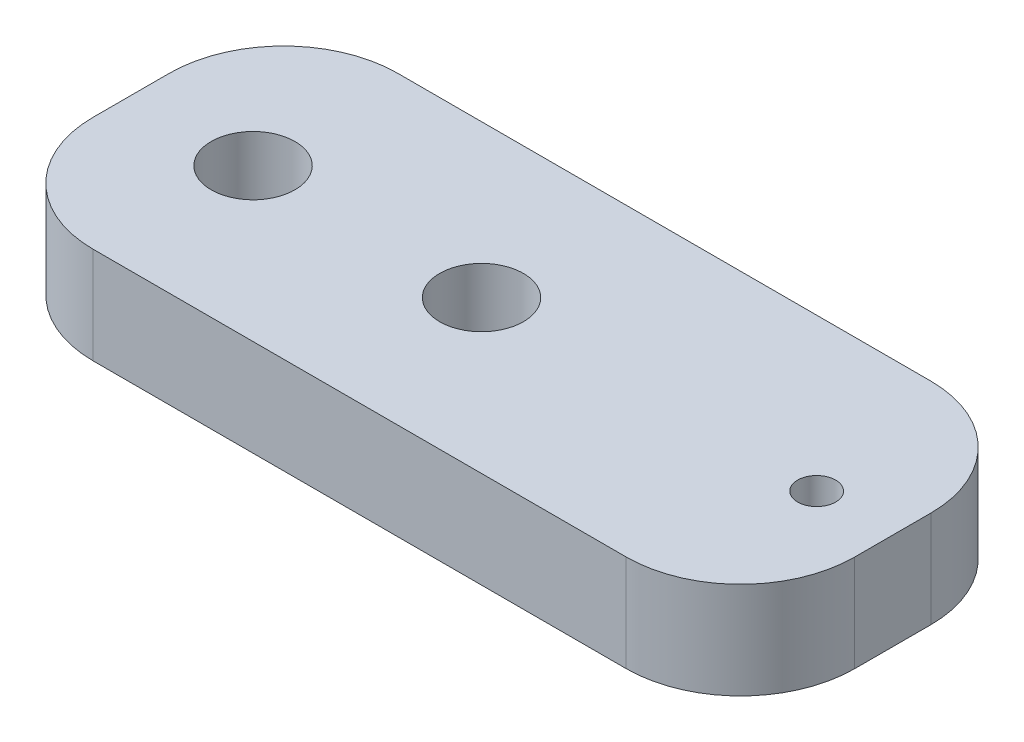
ISO-10303-21;
HEADER;
FILE_DESCRIPTION(('STEP AP214'),'2;1');
FILE_NAME('part.step','',(''),(''),'','','');
FILE_SCHEMA(('AUTOMOTIVE_DESIGN { 1 0 10303 214 1 1 1 1 }'));
ENDSEC;
DATA;
#1=APPLICATION_CONTEXT('core data for automotive mechanical design processes');
#2=APPLICATION_PROTOCOL_DEFINITION('international standard','automotive_design',2000,#1);
#3=PRODUCT_CONTEXT('',#1,'mechanical');
#4=PRODUCT('Part','Part','',(#3));
#5=PRODUCT_RELATED_PRODUCT_CATEGORY('part','',(#4));
#6=PRODUCT_DEFINITION_FORMATION('','',#4);
#7=PRODUCT_DEFINITION_CONTEXT('part definition',#1,'design');
#8=PRODUCT_DEFINITION('design','',#6,#7);
#9=PRODUCT_DEFINITION_SHAPE('','',#8);
#10=(LENGTH_UNIT() NAMED_UNIT(*) SI_UNIT(.MILLI.,.METRE.));
#11=(NAMED_UNIT(*) PLANE_ANGLE_UNIT() SI_UNIT($,.RADIAN.));
#12=(NAMED_UNIT(*) SI_UNIT($,.STERADIAN.) SOLID_ANGLE_UNIT());
#13=UNCERTAINTY_MEASURE_WITH_UNIT(LENGTH_MEASURE(1.E-05),#10,'distance_accuracy_value','');
#14=(GEOMETRIC_REPRESENTATION_CONTEXT(3) GLOBAL_UNCERTAINTY_ASSIGNED_CONTEXT((#13)) GLOBAL_UNIT_ASSIGNED_CONTEXT((#10,
#11,#12)) REPRESENTATION_CONTEXT('',''));
#15=CARTESIAN_POINT('',(0.,0.,0.));
#16=DIRECTION('',(0.,0.,1.));
#17=DIRECTION('',(1.,0.,0.));
#18=AXIS2_PLACEMENT_3D('',#15,#16,#17);
#19=CARTESIAN_POINT('',(0.,6.35,0.));
#20=DIRECTION('',(1.,0.,0.));
#21=DIRECTION('',(0.,0.,-1.));
#22=AXIS2_PLACEMENT_3D('',#19,#20,#21);
#23=PLANE('',#22);
#24=DIRECTION('',(0.,0.,1.));
#25=VECTOR('',#24,1.);
#26=CARTESIAN_POINT('',(0.,6.35,0.));
#27=LINE('',#26,#25);
#28=CARTESIAN_POINT('',(0.,6.35,-12.5));
#29=VERTEX_POINT('',#28);
#30=CARTESIAN_POINT('',(0.,6.35,-7.5));
#31=VERTEX_POINT('',#30);
#32=EDGE_CURVE('E128',#29,#31,#27,.T.);
#33=ORIENTED_EDGE('',*,*,#32,.F.);
#34=DIRECTION('',(0.,-1.,0.));
#35=VECTOR('',#34,1.);
#36=CARTESIAN_POINT('',(0.,6.35,-12.5));
#37=LINE('',#36,#35);
#38=CARTESIAN_POINT('',(0.,0.,-12.5));
#39=VERTEX_POINT('',#38);
#40=EDGE_CURVE('E11',#29,#39,#37,.T.);
#41=ORIENTED_EDGE('',*,*,#40,.T.);
#42=DIRECTION('',(0.,0.,1.));
#43=VECTOR('',#42,1.);
#44=CARTESIAN_POINT('',(0.,0.,0.));
#45=LINE('',#44,#43);
#46=CARTESIAN_POINT('',(0.,0.,-7.5));
#47=VERTEX_POINT('',#46);
#48=EDGE_CURVE('E130',#39,#47,#45,.T.);
#49=ORIENTED_EDGE('',*,*,#48,.T.);
#50=DIRECTION('',(0.,-1.,0.));
#51=VECTOR('',#50,1.);
#52=CARTESIAN_POINT('',(0.,6.35,-7.5));
#53=LINE('',#52,#51);
#54=EDGE_CURVE('E41',#47,#31,#53,.F.);
#55=ORIENTED_EDGE('',*,*,#54,.T.);
#56=EDGE_LOOP('',(#33,#41,#49,#55));
#57=FACE_BOUND('',#56,.T.);
#58=ADVANCED_FACE('F33',(#57),#23,.F.);
#59=CARTESIAN_POINT('',(0.,6.35,0.));
#60=DIRECTION('',(0.,0.,-1.));
#61=DIRECTION('',(-1.,0.,0.));
#62=AXIS2_PLACEMENT_3D('',#59,#60,#61);
#63=PLANE('',#62);
#64=DIRECTION('',(1.,0.,0.));
#65=VECTOR('',#64,1.);
#66=CARTESIAN_POINT('',(0.,0.,0.));
#67=LINE('',#66,#65);
#68=CARTESIAN_POINT('',(7.5,0.,0.));
#69=VERTEX_POINT('',#68);
#70=CARTESIAN_POINT('',(42.5,0.,0.));
#71=VERTEX_POINT('',#70);
#72=EDGE_CURVE('E126',#69,#71,#67,.T.);
#73=ORIENTED_EDGE('',*,*,#72,.T.);
#74=DIRECTION('',(0.,-1.,0.));
#75=VECTOR('',#74,1.);
#76=CARTESIAN_POINT('',(42.5,6.35,0.));
#77=LINE('',#76,#75);
#78=CARTESIAN_POINT('',(42.5,6.35,0.));
#79=VERTEX_POINT('',#78);
#80=EDGE_CURVE('E105',#71,#79,#77,.F.);
#81=ORIENTED_EDGE('',*,*,#80,.T.);
#82=DIRECTION('',(1.,0.,0.));
#83=VECTOR('',#82,1.);
#84=CARTESIAN_POINT('',(0.,6.35,0.));
#85=LINE('',#84,#83);
#86=CARTESIAN_POINT('',(7.5,6.35,0.));
#87=VERTEX_POINT('',#86);
#88=EDGE_CURVE('E166',#87,#79,#85,.T.);
#89=ORIENTED_EDGE('',*,*,#88,.F.);
#90=DIRECTION('',(0.,-1.,0.));
#91=VECTOR('',#90,1.);
#92=CARTESIAN_POINT('',(7.5,6.35,0.));
#93=LINE('',#92,#91);
#94=EDGE_CURVE('E110',#87,#69,#93,.T.);
#95=ORIENTED_EDGE('',*,*,#94,.T.);
#96=EDGE_LOOP('',(#73,#81,#89,#95));
#97=FACE_BOUND('',#96,.T.);
#98=ADVANCED_FACE('F170',(#97),#63,.F.);
#99=CARTESIAN_POINT('',(50.,6.35,0.));
#100=DIRECTION('',(-1.,0.,0.));
#101=DIRECTION('',(0.,0.,1.));
#102=AXIS2_PLACEMENT_3D('',#99,#100,#101);
#103=PLANE('',#102);
#104=DIRECTION('',(0.,0.,-1.));
#105=VECTOR('',#104,1.);
#106=CARTESIAN_POINT('',(50.,6.35,0.));
#107=LINE('',#106,#105);
#108=CARTESIAN_POINT('',(50.,6.35,-7.5));
#109=VERTEX_POINT('',#108);
#110=CARTESIAN_POINT('',(50.,6.35,-12.5));
#111=VERTEX_POINT('',#110);
#112=EDGE_CURVE('E119',#109,#111,#107,.T.);
#113=ORIENTED_EDGE('',*,*,#112,.F.);
#114=DIRECTION('',(0.,-1.,0.));
#115=VECTOR('',#114,1.);
#116=CARTESIAN_POINT('',(50.,6.35,-7.5));
#117=LINE('',#116,#115);
#118=CARTESIAN_POINT('',(50.,0.,-7.5));
#119=VERTEX_POINT('',#118);
#120=EDGE_CURVE('E104',#109,#119,#117,.T.);
#121=ORIENTED_EDGE('',*,*,#120,.T.);
#122=DIRECTION('',(0.,0.,-1.));
#123=VECTOR('',#122,1.);
#124=CARTESIAN_POINT('',(50.,0.,0.));
#125=LINE('',#124,#123);
#126=CARTESIAN_POINT('',(50.,0.,-12.5));
#127=VERTEX_POINT('',#126);
#128=EDGE_CURVE('E117',#119,#127,#125,.T.);
#129=ORIENTED_EDGE('',*,*,#128,.T.);
#130=DIRECTION('',(0.,-1.,0.));
#131=VECTOR('',#130,1.);
#132=CARTESIAN_POINT('',(50.,6.35,-12.5));
#133=LINE('',#132,#131);
#134=EDGE_CURVE('E121',#127,#111,#133,.F.);
#135=ORIENTED_EDGE('',*,*,#134,.T.);
#136=EDGE_LOOP('',(#113,#121,#129,#135));
#137=FACE_BOUND('',#136,.T.);
#138=ADVANCED_FACE('F116',(#137),#103,.F.);
#139=CARTESIAN_POINT('',(0.,6.35,-20.));
#140=DIRECTION('',(0.,0.,1.));
#141=DIRECTION('',(1.,0.,0.));
#142=AXIS2_PLACEMENT_3D('',#139,#140,#141);
#143=PLANE('',#142);
#144=DIRECTION('',(-1.,0.,0.));
#145=VECTOR('',#144,1.);
#146=CARTESIAN_POINT('',(0.,6.35,-20.));
#147=LINE('',#146,#145);
#148=CARTESIAN_POINT('',(42.5,6.35,-20.));
#149=VERTEX_POINT('',#148);
#150=CARTESIAN_POINT('',(7.5,6.35,-20.));
#151=VERTEX_POINT('',#150);
#152=EDGE_CURVE('E134',#149,#151,#147,.T.);
#153=ORIENTED_EDGE('',*,*,#152,.F.);
#154=DIRECTION('',(0.,-1.,0.));
#155=VECTOR('',#154,1.);
#156=CARTESIAN_POINT('',(42.5,6.35,-20.));
#157=LINE('',#156,#155);
#158=CARTESIAN_POINT('',(42.5,0.,-20.));
#159=VERTEX_POINT('',#158);
#160=EDGE_CURVE('E151',#149,#159,#157,.T.);
#161=ORIENTED_EDGE('',*,*,#160,.T.);
#162=DIRECTION('',(-1.,0.,0.));
#163=VECTOR('',#162,1.);
#164=CARTESIAN_POINT('',(0.,0.,-20.));
#165=LINE('',#164,#163);
#166=CARTESIAN_POINT('',(7.5,0.,-20.));
#167=VERTEX_POINT('',#166);
#168=EDGE_CURVE('E125',#159,#167,#165,.T.);
#169=ORIENTED_EDGE('',*,*,#168,.T.);
#170=DIRECTION('',(0.,-1.,0.));
#171=VECTOR('',#170,1.);
#172=CARTESIAN_POINT('',(7.5,6.35,-20.));
#173=LINE('',#172,#171);
#174=EDGE_CURVE('E48',#167,#151,#173,.F.);
#175=ORIENTED_EDGE('',*,*,#174,.T.);
#176=EDGE_LOOP('',(#153,#161,#169,#175));
#177=FACE_BOUND('',#176,.T.);
#178=ADVANCED_FACE('F198',(#177),#143,.F.);
#179=CARTESIAN_POINT('',(0.,6.35,0.));
#180=DIRECTION('',(0.,-1.,0.));
#181=DIRECTION('',(0.,0.,-1.));
#182=AXIS2_PLACEMENT_3D('',#179,#180,#181);
#183=PLANE('',#182);
#184=CARTESIAN_POINT('',(45.,6.35,-9.99999999999999));
#185=DIRECTION('',(0.,1.,0.));
#186=DIRECTION('',(0.,0.,1.));
#187=AXIS2_PLACEMENT_3D('',#184,#185,#186);
#188=CIRCLE('',#187,1.25);
#189=CARTESIAN_POINT('',(45.,6.35,-8.74999999999999));
#190=VERTEX_POINT('',#189);
#191=EDGE_CURVE('E190',#190,#190,#188,.T.);
#192=ORIENTED_EDGE('',*,*,#191,.F.);
#193=EDGE_LOOP('',(#192));
#194=FACE_BOUND('',#193,.T.);
#195=CARTESIAN_POINT('',(8.,6.35,-10.));
#196=DIRECTION('',(0.,1.,0.));
#197=DIRECTION('',(0.,0.,1.));
#198=AXIS2_PLACEMENT_3D('',#195,#196,#197);
#199=CIRCLE('',#198,2.75);
#200=CARTESIAN_POINT('',(8.,6.35,-7.25));
#201=VERTEX_POINT('',#200);
#202=EDGE_CURVE('E184',#201,#201,#199,.T.);
#203=ORIENTED_EDGE('',*,*,#202,.F.);
#204=EDGE_LOOP('',(#203));
#205=FACE_BOUND('',#204,.T.);
#206=CARTESIAN_POINT('',(23.,6.35,-10.));
#207=DIRECTION('',(0.,1.,0.));
#208=DIRECTION('',(0.,0.,1.));
#209=AXIS2_PLACEMENT_3D('',#206,#207,#208);
#210=CIRCLE('',#209,2.75);
#211=CARTESIAN_POINT('',(23.,6.35,-7.25));
#212=VERTEX_POINT('',#211);
#213=EDGE_CURVE('E173',#212,#212,#210,.T.);
#214=ORIENTED_EDGE('',*,*,#213,.F.);
#215=EDGE_LOOP('',(#214));
#216=FACE_BOUND('',#215,.T.);
#217=ORIENTED_EDGE('',*,*,#88,.T.);
#218=CARTESIAN_POINT('',(42.5,6.35,-7.5));
#219=DIRECTION('',(0.,-1.,0.));
#220=DIRECTION('',(0.,0.,-1.));
#221=AXIS2_PLACEMENT_3D('',#218,#219,#220);
#222=CIRCLE('',#221,7.5);
#223=EDGE_CURVE('E148',#79,#109,#222,.F.);
#224=ORIENTED_EDGE('',*,*,#223,.T.);
#225=ORIENTED_EDGE('',*,*,#112,.T.);
#226=CARTESIAN_POINT('',(42.5,6.35,-12.5));
#227=DIRECTION('',(0.,-1.,0.));
#228=DIRECTION('',(0.,0.,-1.));
#229=AXIS2_PLACEMENT_3D('',#226,#227,#228);
#230=CIRCLE('',#229,7.5);
#231=EDGE_CURVE('E55',#111,#149,#230,.F.);
#232=ORIENTED_EDGE('',*,*,#231,.T.);
#233=ORIENTED_EDGE('',*,*,#152,.T.);
#234=CARTESIAN_POINT('',(7.5,6.35,-12.5));
#235=DIRECTION('',(0.,-1.,0.));
#236=DIRECTION('',(0.,0.,-1.));
#237=AXIS2_PLACEMENT_3D('',#234,#235,#236);
#238=CIRCLE('',#237,7.5);
#239=EDGE_CURVE('E145',#151,#29,#238,.F.);
#240=ORIENTED_EDGE('',*,*,#239,.T.);
#241=ORIENTED_EDGE('',*,*,#32,.T.);
#242=CARTESIAN_POINT('',(7.5,6.35,-7.5));
#243=DIRECTION('',(0.,-1.,0.));
#244=DIRECTION('',(0.,0.,-1.));
#245=AXIS2_PLACEMENT_3D('',#242,#243,#244);
#246=CIRCLE('',#245,7.5);
#247=EDGE_CURVE('E143',#31,#87,#246,.F.);
#248=ORIENTED_EDGE('',*,*,#247,.T.);
#249=EDGE_LOOP('',(#217,#224,#225,#232,#233,#240,#241,#248));
#250=FACE_BOUND('',#249,.T.);
#251=ADVANCED_FACE('F163',(#194,#205,#216,#250),#183,.F.);
#252=CARTESIAN_POINT('',(0.,0.,0.));
#253=DIRECTION('',(0.,-1.,0.));
#254=DIRECTION('',(0.,0.,-1.));
#255=AXIS2_PLACEMENT_3D('',#252,#253,#254);
#256=PLANE('',#255);
#257=CARTESIAN_POINT('',(45.,0.,-9.99999999999999));
#258=DIRECTION('',(0.,1.,0.));
#259=DIRECTION('',(0.,0.,1.));
#260=AXIS2_PLACEMENT_3D('',#257,#258,#259);
#261=CIRCLE('',#260,1.25);
#262=CARTESIAN_POINT('',(45.,0.,-8.74999999999999));
#263=VERTEX_POINT('',#262);
#264=EDGE_CURVE('E187',#263,#263,#261,.T.);
#265=ORIENTED_EDGE('',*,*,#264,.T.);
#266=EDGE_LOOP('',(#265));
#267=FACE_BOUND('',#266,.T.);
#268=CARTESIAN_POINT('',(8.,0.,-10.));
#269=DIRECTION('',(0.,1.,0.));
#270=DIRECTION('',(0.,0.,1.));
#271=AXIS2_PLACEMENT_3D('',#268,#269,#270);
#272=CIRCLE('',#271,2.75);
#273=CARTESIAN_POINT('',(8.,0.,-7.25));
#274=VERTEX_POINT('',#273);
#275=EDGE_CURVE('E181',#274,#274,#272,.T.);
#276=ORIENTED_EDGE('',*,*,#275,.T.);
#277=EDGE_LOOP('',(#276));
#278=FACE_BOUND('',#277,.T.);
#279=CARTESIAN_POINT('',(23.,0.,-10.));
#280=DIRECTION('',(0.,1.,0.));
#281=DIRECTION('',(0.,0.,1.));
#282=AXIS2_PLACEMENT_3D('',#279,#280,#281);
#283=CIRCLE('',#282,2.75);
#284=CARTESIAN_POINT('',(23.,0.,-7.25));
#285=VERTEX_POINT('',#284);
#286=EDGE_CURVE('E171',#285,#285,#283,.T.);
#287=ORIENTED_EDGE('',*,*,#286,.T.);
#288=EDGE_LOOP('',(#287));
#289=FACE_BOUND('',#288,.T.);
#290=ORIENTED_EDGE('',*,*,#128,.F.);
#291=CARTESIAN_POINT('',(42.5,0.,-7.5));
#292=DIRECTION('',(0.,-1.,0.));
#293=DIRECTION('',(0.,0.,-1.));
#294=AXIS2_PLACEMENT_3D('',#291,#292,#293);
#295=CIRCLE('',#294,7.5);
#296=EDGE_CURVE('E100',#119,#71,#295,.T.);
#297=ORIENTED_EDGE('',*,*,#296,.T.);
#298=ORIENTED_EDGE('',*,*,#72,.F.);
#299=CARTESIAN_POINT('',(7.5,0.,-7.5));
#300=DIRECTION('',(0.,-1.,0.));
#301=DIRECTION('',(0.,0.,-1.));
#302=AXIS2_PLACEMENT_3D('',#299,#300,#301);
#303=CIRCLE('',#302,7.5);
#304=EDGE_CURVE('E120',#69,#47,#303,.T.);
#305=ORIENTED_EDGE('',*,*,#304,.T.);
#306=ORIENTED_EDGE('',*,*,#48,.F.);
#307=CARTESIAN_POINT('',(7.5,0.,-12.5));
#308=DIRECTION('',(0.,-1.,0.));
#309=DIRECTION('',(0.,0.,-1.));
#310=AXIS2_PLACEMENT_3D('',#307,#308,#309);
#311=CIRCLE('',#310,7.5);
#312=EDGE_CURVE('E137',#39,#167,#311,.T.);
#313=ORIENTED_EDGE('',*,*,#312,.T.);
#314=ORIENTED_EDGE('',*,*,#168,.F.);
#315=CARTESIAN_POINT('',(42.5,0.,-12.5));
#316=DIRECTION('',(0.,-1.,0.));
#317=DIRECTION('',(0.,0.,-1.));
#318=AXIS2_PLACEMENT_3D('',#315,#316,#317);
#319=CIRCLE('',#318,7.5);
#320=EDGE_CURVE('E111',#159,#127,#319,.T.);
#321=ORIENTED_EDGE('',*,*,#320,.T.);
#322=EDGE_LOOP('',(#290,#297,#298,#305,#306,#313,#314,#321));
#323=FACE_BOUND('',#322,.T.);
#324=ADVANCED_FACE('F123',(#267,#278,#289,#323),#256,.T.);
#325=CARTESIAN_POINT('',(23.,6.35,-10.));
#326=DIRECTION('',(0.,1.,0.));
#327=DIRECTION('',(0.,0.,1.));
#328=AXIS2_PLACEMENT_3D('',#325,#326,#327);
#329=CYLINDRICAL_SURFACE('',#328,2.75);
#330=ORIENTED_EDGE('',*,*,#286,.F.);
#331=EDGE_LOOP('',(#330));
#332=FACE_BOUND('',#331,.T.);
#333=ORIENTED_EDGE('',*,*,#213,.T.);
#334=EDGE_LOOP('',(#333));
#335=FACE_BOUND('',#334,.T.);
#336=ADVANCED_FACE('F204',(#332,#335),#329,.F.);
#337=CARTESIAN_POINT('',(8.,6.35,-10.));
#338=DIRECTION('',(0.,1.,0.));
#339=DIRECTION('',(0.,0.,1.));
#340=AXIS2_PLACEMENT_3D('',#337,#338,#339);
#341=CYLINDRICAL_SURFACE('',#340,2.75);
#342=ORIENTED_EDGE('',*,*,#275,.F.);
#343=EDGE_LOOP('',(#342));
#344=FACE_BOUND('',#343,.T.);
#345=ORIENTED_EDGE('',*,*,#202,.T.);
#346=EDGE_LOOP('',(#345));
#347=FACE_BOUND('',#346,.T.);
#348=ADVANCED_FACE('F206',(#344,#347),#341,.F.);
#349=CARTESIAN_POINT('',(45.,6.35,-9.99999999999999));
#350=DIRECTION('',(0.,1.,0.));
#351=DIRECTION('',(0.,0.,1.));
#352=AXIS2_PLACEMENT_3D('',#349,#350,#351);
#353=CYLINDRICAL_SURFACE('',#352,1.25);
#354=ORIENTED_EDGE('',*,*,#264,.F.);
#355=EDGE_LOOP('',(#354));
#356=FACE_BOUND('',#355,.T.);
#357=ORIENTED_EDGE('',*,*,#191,.T.);
#358=EDGE_LOOP('',(#357));
#359=FACE_BOUND('',#358,.T.);
#360=ADVANCED_FACE('F194',(#356,#359),#353,.F.);
#361=CARTESIAN_POINT('',(42.5,6.35,-7.5));
#362=DIRECTION('',(0.,-1.,0.));
#363=DIRECTION('',(0.,0.,-1.));
#364=AXIS2_PLACEMENT_3D('',#361,#362,#363);
#365=CYLINDRICAL_SURFACE('',#364,7.5);
#366=ORIENTED_EDGE('',*,*,#223,.F.);
#367=ORIENTED_EDGE('',*,*,#80,.F.);
#368=ORIENTED_EDGE('',*,*,#296,.F.);
#369=ORIENTED_EDGE('',*,*,#120,.F.);
#370=EDGE_LOOP('',(#366,#367,#368,#369));
#371=FACE_BOUND('',#370,.T.);
#372=ADVANCED_FACE('F103',(#371),#365,.T.);
#373=CARTESIAN_POINT('',(42.5,6.35,-12.5));
#374=DIRECTION('',(0.,-1.,0.));
#375=DIRECTION('',(0.,0.,-1.));
#376=AXIS2_PLACEMENT_3D('',#373,#374,#375);
#377=CYLINDRICAL_SURFACE('',#376,7.5);
#378=ORIENTED_EDGE('',*,*,#231,.F.);
#379=ORIENTED_EDGE('',*,*,#134,.F.);
#380=ORIENTED_EDGE('',*,*,#320,.F.);
#381=ORIENTED_EDGE('',*,*,#160,.F.);
#382=EDGE_LOOP('',(#378,#379,#380,#381));
#383=FACE_BOUND('',#382,.T.);
#384=ADVANCED_FACE('F228',(#383),#377,.T.);
#385=CARTESIAN_POINT('',(7.5,6.35,-12.5));
#386=DIRECTION('',(0.,-1.,0.));
#387=DIRECTION('',(0.,0.,-1.));
#388=AXIS2_PLACEMENT_3D('',#385,#386,#387);
#389=CYLINDRICAL_SURFACE('',#388,7.5);
#390=ORIENTED_EDGE('',*,*,#239,.F.);
#391=ORIENTED_EDGE('',*,*,#174,.F.);
#392=ORIENTED_EDGE('',*,*,#312,.F.);
#393=ORIENTED_EDGE('',*,*,#40,.F.);
#394=EDGE_LOOP('',(#390,#391,#392,#393));
#395=FACE_BOUND('',#394,.T.);
#396=ADVANCED_FACE('F230',(#395),#389,.T.);
#397=CARTESIAN_POINT('',(7.5,6.35,-7.5));
#398=DIRECTION('',(0.,-1.,0.));
#399=DIRECTION('',(0.,0.,-1.));
#400=AXIS2_PLACEMENT_3D('',#397,#398,#399);
#401=CYLINDRICAL_SURFACE('',#400,7.5);
#402=ORIENTED_EDGE('',*,*,#247,.F.);
#403=ORIENTED_EDGE('',*,*,#54,.F.);
#404=ORIENTED_EDGE('',*,*,#304,.F.);
#405=ORIENTED_EDGE('',*,*,#94,.F.);
#406=EDGE_LOOP('',(#402,#403,#404,#405));
#407=FACE_BOUND('',#406,.T.);
#408=ADVANCED_FACE('F35',(#407),#401,.T.);
#409=CLOSED_SHELL('',(#58,#98,#138,#178,#251,#324,#336,#348,#360,#372,#384,#396,#408));
#410=MANIFOLD_SOLID_BREP('B2',#409);
#411=ADVANCED_BREP_SHAPE_REPRESENTATION('',(#18,#410),#14);
#412=SHAPE_DEFINITION_REPRESENTATION(#9,#411);
ENDSEC;
END-ISO-10303-21;
